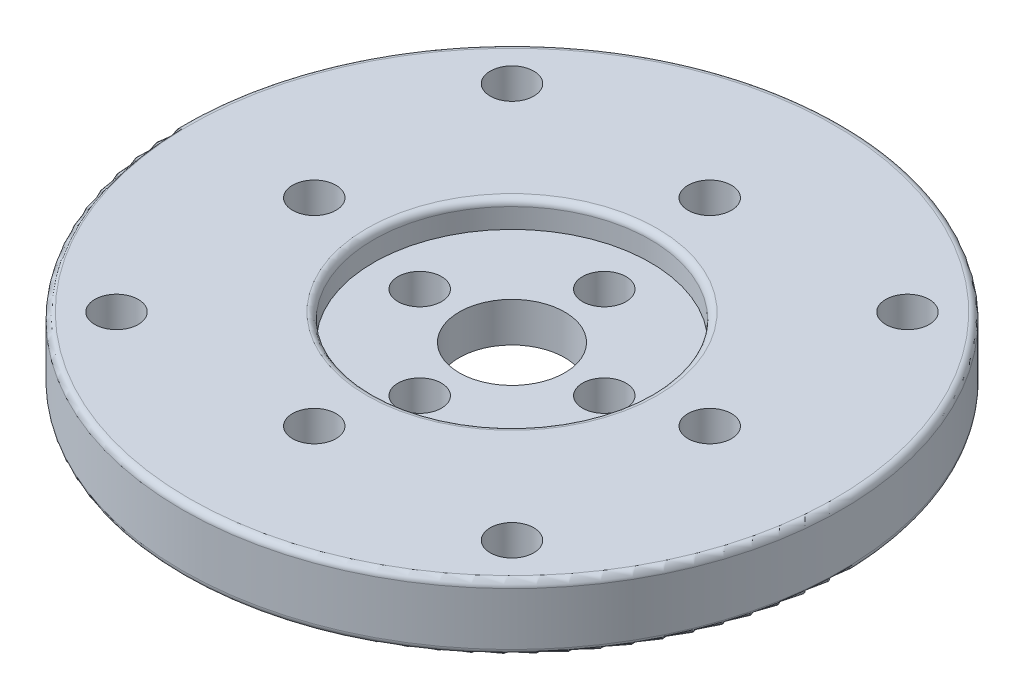
ISO-10303-21;
HEADER;
FILE_DESCRIPTION(('STEP AP214'),'2;1');
FILE_NAME('part.step','',(''),(''),'','','');
FILE_SCHEMA(('AUTOMOTIVE_DESIGN { 1 0 10303 214 1 1 1 1 }'));
ENDSEC;
DATA;
#1=APPLICATION_CONTEXT('core data for automotive mechanical design processes');
#2=APPLICATION_PROTOCOL_DEFINITION('international standard','automotive_design',2000,#1);
#3=PRODUCT_CONTEXT('',#1,'mechanical');
#4=PRODUCT('Part','Part','',(#3));
#5=PRODUCT_RELATED_PRODUCT_CATEGORY('part','',(#4));
#6=PRODUCT_DEFINITION_FORMATION('','',#4);
#7=PRODUCT_DEFINITION_CONTEXT('part definition',#1,'design');
#8=PRODUCT_DEFINITION('design','',#6,#7);
#9=PRODUCT_DEFINITION_SHAPE('','',#8);
#10=(LENGTH_UNIT() NAMED_UNIT(*) SI_UNIT(.MILLI.,.METRE.));
#11=(NAMED_UNIT(*) PLANE_ANGLE_UNIT() SI_UNIT($,.RADIAN.));
#12=(NAMED_UNIT(*) SI_UNIT($,.STERADIAN.) SOLID_ANGLE_UNIT());
#13=UNCERTAINTY_MEASURE_WITH_UNIT(LENGTH_MEASURE(1.E-05),#10,'distance_accuracy_value','');
#14=(GEOMETRIC_REPRESENTATION_CONTEXT(3) GLOBAL_UNCERTAINTY_ASSIGNED_CONTEXT((#13)) GLOBAL_UNIT_ASSIGNED_CONTEXT((#10,
#11,#12)) REPRESENTATION_CONTEXT('',''));
#15=CARTESIAN_POINT('',(0.,0.,0.));
#16=DIRECTION('',(0.,0.,1.));
#17=DIRECTION('',(1.,0.,0.));
#18=AXIS2_PLACEMENT_3D('',#15,#16,#17);
#19=CARTESIAN_POINT('',(0.,2.5,0.));
#20=DIRECTION('',(0.,-1.,0.));
#21=DIRECTION('',(0.,0.,-1.));
#22=AXIS2_PLACEMENT_3D('',#19,#20,#21);
#23=CYLINDRICAL_SURFACE('',#22,4.);
#24=CARTESIAN_POINT('',(0.,-2.5,0.));
#25=DIRECTION('',(0.,1.,0.));
#26=DIRECTION('',(0.,0.,1.));
#27=AXIS2_PLACEMENT_3D('',#24,#25,#26);
#28=CIRCLE('',#27,4.);
#29=CARTESIAN_POINT('',(0.,-2.5,4.));
#30=VERTEX_POINT('',#29);
#31=EDGE_CURVE('E59',#30,#30,#28,.T.);
#32=ORIENTED_EDGE('',*,*,#31,.F.);
#33=EDGE_LOOP('',(#32));
#34=FACE_BOUND('',#33,.T.);
#35=CARTESIAN_POINT('',(0.,0.5,0.));
#36=DIRECTION('',(0.,1.,0.));
#37=DIRECTION('',(0.,0.,1.));
#38=AXIS2_PLACEMENT_3D('',#35,#36,#37);
#39=CIRCLE('',#38,4.);
#40=CARTESIAN_POINT('',(0.,0.5,4.));
#41=VERTEX_POINT('',#40);
#42=EDGE_CURVE('E60',#41,#41,#39,.T.);
#43=ORIENTED_EDGE('',*,*,#42,.T.);
#44=EDGE_LOOP('',(#43));
#45=FACE_BOUND('',#44,.T.);
#46=ADVANCED_FACE('F33',(#34,#45),#23,.F.);
#47=CARTESIAN_POINT('',(0.,2.5,0.));
#48=DIRECTION('',(0.,1.,0.));
#49=DIRECTION('',(0.,0.,1.));
#50=AXIS2_PLACEMENT_3D('',#47,#48,#49);
#51=PLANE('',#50);
#52=CARTESIAN_POINT('',(0.,2.5,0.));
#53=DIRECTION('',(0.,1.,0.));
#54=DIRECTION('',(0.,0.,1.));
#55=AXIS2_PLACEMENT_3D('',#52,#53,#54);
#56=CIRCLE('',#55,11.);
#57=CARTESIAN_POINT('',(0.,2.5,11.));
#58=VERTEX_POINT('',#57);
#59=EDGE_CURVE('E48',#58,#58,#56,.F.);
#60=ORIENTED_EDGE('',*,*,#59,.T.);
#61=EDGE_LOOP('',(#60));
#62=FACE_BOUND('',#61,.T.);
#63=CARTESIAN_POINT('',(0.,2.5,0.));
#64=DIRECTION('',(0.,1.,0.));
#65=DIRECTION('',(0.,0.,1.));
#66=AXIS2_PLACEMENT_3D('',#63,#64,#65);
#67=CIRCLE('',#66,24.5);
#68=CARTESIAN_POINT('',(0.,2.5,24.5));
#69=VERTEX_POINT('',#68);
#70=EDGE_CURVE('E53',#69,#69,#67,.T.);
#71=ORIENTED_EDGE('',*,*,#70,.T.);
#72=EDGE_LOOP('',(#71));
#73=FACE_BOUND('',#72,.T.);
#74=CARTESIAN_POINT('',(15.,2.5,15.));
#75=DIRECTION('',(0.,1.,0.));
#76=DIRECTION('',(0.,0.,1.));
#77=AXIS2_PLACEMENT_3D('',#74,#75,#76);
#78=CIRCLE('',#77,1.65);
#79=CARTESIAN_POINT('',(15.,2.5,16.65));
#80=VERTEX_POINT('',#79);
#81=EDGE_CURVE('E94',#80,#80,#78,.F.);
#82=ORIENTED_EDGE('',*,*,#81,.T.);
#83=EDGE_LOOP('',(#82));
#84=FACE_BOUND('',#83,.T.);
#85=CARTESIAN_POINT('',(15.,2.5,-15.));
#86=DIRECTION('',(0.,1.,0.));
#87=DIRECTION('',(0.,0.,1.));
#88=AXIS2_PLACEMENT_3D('',#85,#86,#87);
#89=CIRCLE('',#88,1.65);
#90=CARTESIAN_POINT('',(15.,2.5,-13.35));
#91=VERTEX_POINT('',#90);
#92=EDGE_CURVE('E88',#91,#91,#89,.F.);
#93=ORIENTED_EDGE('',*,*,#92,.T.);
#94=EDGE_LOOP('',(#93));
#95=FACE_BOUND('',#94,.T.);
#96=CARTESIAN_POINT('',(-15.,2.5,-15.));
#97=DIRECTION('',(0.,1.,0.));
#98=DIRECTION('',(0.,0.,1.));
#99=AXIS2_PLACEMENT_3D('',#96,#97,#98);
#100=CIRCLE('',#99,1.65);
#101=CARTESIAN_POINT('',(-15.,2.5,-13.35));
#102=VERTEX_POINT('',#101);
#103=EDGE_CURVE('E82',#102,#102,#100,.F.);
#104=ORIENTED_EDGE('',*,*,#103,.T.);
#105=EDGE_LOOP('',(#104));
#106=FACE_BOUND('',#105,.T.);
#107=CARTESIAN_POINT('',(0.,2.5,15.));
#108=DIRECTION('',(0.,1.,0.));
#109=DIRECTION('',(0.,0.,1.));
#110=AXIS2_PLACEMENT_3D('',#107,#108,#109);
#111=CIRCLE('',#110,1.65);
#112=CARTESIAN_POINT('',(0.,2.5,16.65));
#113=VERTEX_POINT('',#112);
#114=EDGE_CURVE('E75',#113,#113,#111,.F.);
#115=ORIENTED_EDGE('',*,*,#114,.T.);
#116=EDGE_LOOP('',(#115));
#117=FACE_BOUND('',#116,.T.);
#118=CARTESIAN_POINT('',(15.,2.5,0.));
#119=DIRECTION('',(0.,1.,0.));
#120=DIRECTION('',(0.,0.,1.));
#121=AXIS2_PLACEMENT_3D('',#118,#119,#120);
#122=CIRCLE('',#121,1.65);
#123=CARTESIAN_POINT('',(15.,2.5,1.65));
#124=VERTEX_POINT('',#123);
#125=EDGE_CURVE('E112',#124,#124,#122,.F.);
#126=ORIENTED_EDGE('',*,*,#125,.T.);
#127=EDGE_LOOP('',(#126));
#128=FACE_BOUND('',#127,.T.);
#129=CARTESIAN_POINT('',(0.,2.5,-15.));
#130=DIRECTION('',(0.,1.,0.));
#131=DIRECTION('',(0.,0.,1.));
#132=AXIS2_PLACEMENT_3D('',#129,#130,#131);
#133=CIRCLE('',#132,1.65);
#134=CARTESIAN_POINT('',(0.,2.5,-13.35));
#135=VERTEX_POINT('',#134);
#136=EDGE_CURVE('E106',#135,#135,#133,.F.);
#137=ORIENTED_EDGE('',*,*,#136,.T.);
#138=EDGE_LOOP('',(#137));
#139=FACE_BOUND('',#138,.T.);
#140=CARTESIAN_POINT('',(-15.,2.5,0.));
#141=DIRECTION('',(0.,1.,0.));
#142=DIRECTION('',(0.,0.,1.));
#143=AXIS2_PLACEMENT_3D('',#140,#141,#142);
#144=CIRCLE('',#143,1.65);
#145=CARTESIAN_POINT('',(-15.,2.5,1.65));
#146=VERTEX_POINT('',#145);
#147=EDGE_CURVE('E99',#146,#146,#144,.F.);
#148=ORIENTED_EDGE('',*,*,#147,.T.);
#149=EDGE_LOOP('',(#148));
#150=FACE_BOUND('',#149,.T.);
#151=CARTESIAN_POINT('',(-15.,2.5,15.));
#152=DIRECTION('',(0.,1.,0.));
#153=DIRECTION('',(0.,0.,1.));
#154=AXIS2_PLACEMENT_3D('',#151,#152,#153);
#155=CIRCLE('',#154,1.65);
#156=CARTESIAN_POINT('',(-15.,2.5,16.65));
#157=VERTEX_POINT('',#156);
#158=EDGE_CURVE('E69',#157,#157,#155,.F.);
#159=ORIENTED_EDGE('',*,*,#158,.T.);
#160=EDGE_LOOP('',(#159));
#161=FACE_BOUND('',#160,.T.);
#162=ADVANCED_FACE('F171',(#62,#73,#84,#95,#106,#117,#128,#139,#150,#161),#51,.T.);
#163=CARTESIAN_POINT('',(0.,-2.5,0.));
#164=DIRECTION('',(0.,1.,0.));
#165=DIRECTION('',(0.,0.,1.));
#166=AXIS2_PLACEMENT_3D('',#163,#164,#165);
#167=PLANE('',#166);
#168=CARTESIAN_POINT('',(0.,-2.5,-7.));
#169=DIRECTION('',(0.,1.,0.));
#170=DIRECTION('',(0.,0.,1.));
#171=AXIS2_PLACEMENT_3D('',#168,#169,#170);
#172=CIRCLE('',#171,1.65);
#173=CARTESIAN_POINT('',(0.,-2.5,-5.35));
#174=VERTEX_POINT('',#173);
#175=EDGE_CURVE('E103',#174,#174,#172,.F.);
#176=ORIENTED_EDGE('',*,*,#175,.F.);
#177=EDGE_LOOP('',(#176));
#178=FACE_BOUND('',#177,.T.);
#179=CARTESIAN_POINT('',(0.,-2.5,7.));
#180=DIRECTION('',(0.,1.,0.));
#181=DIRECTION('',(0.,0.,1.));
#182=AXIS2_PLACEMENT_3D('',#179,#180,#181);
#183=CIRCLE('',#182,1.65);
#184=CARTESIAN_POINT('',(0.,-2.5,8.65));
#185=VERTEX_POINT('',#184);
#186=EDGE_CURVE('E130',#185,#185,#183,.F.);
#187=ORIENTED_EDGE('',*,*,#186,.F.);
#188=EDGE_LOOP('',(#187));
#189=FACE_BOUND('',#188,.T.);
#190=CARTESIAN_POINT('',(7.,-2.5,0.));
#191=DIRECTION('',(0.,1.,0.));
#192=DIRECTION('',(0.,0.,1.));
#193=AXIS2_PLACEMENT_3D('',#190,#191,#192);
#194=CIRCLE('',#193,1.65);
#195=CARTESIAN_POINT('',(7.,-2.5,1.65));
#196=VERTEX_POINT('',#195);
#197=EDGE_CURVE('E124',#196,#196,#194,.F.);
#198=ORIENTED_EDGE('',*,*,#197,.F.);
#199=EDGE_LOOP('',(#198));
#200=FACE_BOUND('',#199,.T.);
#201=CARTESIAN_POINT('',(-7.,-2.5,0.));
#202=DIRECTION('',(0.,1.,0.));
#203=DIRECTION('',(0.,0.,1.));
#204=AXIS2_PLACEMENT_3D('',#201,#202,#203);
#205=CIRCLE('',#204,1.65);
#206=CARTESIAN_POINT('',(-7.,-2.5,1.65));
#207=VERTEX_POINT('',#206);
#208=EDGE_CURVE('E117',#207,#207,#205,.F.);
#209=ORIENTED_EDGE('',*,*,#208,.F.);
#210=EDGE_LOOP('',(#209));
#211=FACE_BOUND('',#210,.T.);
#212=CARTESIAN_POINT('',(0.,-2.5,0.));
#213=DIRECTION('',(0.,1.,0.));
#214=DIRECTION('',(0.,0.,1.));
#215=AXIS2_PLACEMENT_3D('',#212,#213,#214);
#216=CIRCLE('',#215,24.5);
#217=CARTESIAN_POINT('',(0.,-2.5,24.5));
#218=VERTEX_POINT('',#217);
#219=EDGE_CURVE('E10',#218,#218,#216,.F.);
#220=ORIENTED_EDGE('',*,*,#219,.T.);
#221=EDGE_LOOP('',(#220));
#222=FACE_BOUND('',#221,.T.);
#223=CARTESIAN_POINT('',(15.,-2.5,15.));
#224=DIRECTION('',(0.,-1.,0.));
#225=DIRECTION('',(0.,0.,-1.));
#226=AXIS2_PLACEMENT_3D('',#223,#224,#225);
#227=CIRCLE('',#226,1.65);
#228=CARTESIAN_POINT('',(15.,-2.5,13.35));
#229=VERTEX_POINT('',#228);
#230=EDGE_CURVE('E72',#229,#229,#227,.T.);
#231=ORIENTED_EDGE('',*,*,#230,.F.);
#232=EDGE_LOOP('',(#231));
#233=FACE_BOUND('',#232,.T.);
#234=CARTESIAN_POINT('',(15.,-2.5,-15.));
#235=DIRECTION('',(0.,-1.,0.));
#236=DIRECTION('',(0.,0.,-1.));
#237=AXIS2_PLACEMENT_3D('',#234,#235,#236);
#238=CIRCLE('',#237,1.65);
#239=CARTESIAN_POINT('',(15.,-2.5,-16.65));
#240=VERTEX_POINT('',#239);
#241=EDGE_CURVE('E91',#240,#240,#238,.T.);
#242=ORIENTED_EDGE('',*,*,#241,.F.);
#243=EDGE_LOOP('',(#242));
#244=FACE_BOUND('',#243,.T.);
#245=CARTESIAN_POINT('',(-15.,-2.5,-15.));
#246=DIRECTION('',(0.,-1.,0.));
#247=DIRECTION('',(0.,0.,-1.));
#248=AXIS2_PLACEMENT_3D('',#245,#246,#247);
#249=CIRCLE('',#248,1.65);
#250=CARTESIAN_POINT('',(-15.,-2.5,-16.65));
#251=VERTEX_POINT('',#250);
#252=EDGE_CURVE('E85',#251,#251,#249,.T.);
#253=ORIENTED_EDGE('',*,*,#252,.F.);
#254=EDGE_LOOP('',(#253));
#255=FACE_BOUND('',#254,.T.);
#256=CARTESIAN_POINT('',(0.,-2.5,15.));
#257=DIRECTION('',(0.,-1.,0.));
#258=DIRECTION('',(0.,0.,-1.));
#259=AXIS2_PLACEMENT_3D('',#256,#257,#258);
#260=CIRCLE('',#259,1.65);
#261=CARTESIAN_POINT('',(0.,-2.5,13.35));
#262=VERTEX_POINT('',#261);
#263=EDGE_CURVE('E78',#262,#262,#260,.T.);
#264=ORIENTED_EDGE('',*,*,#263,.F.);
#265=EDGE_LOOP('',(#264));
#266=FACE_BOUND('',#265,.T.);
#267=CARTESIAN_POINT('',(15.,-2.5,0.));
#268=DIRECTION('',(0.,-1.,0.));
#269=DIRECTION('',(0.,0.,-1.));
#270=AXIS2_PLACEMENT_3D('',#267,#268,#269);
#271=CIRCLE('',#270,1.65);
#272=CARTESIAN_POINT('',(15.,-2.5,-1.65));
#273=VERTEX_POINT('',#272);
#274=EDGE_CURVE('E79',#273,#273,#271,.T.);
#275=ORIENTED_EDGE('',*,*,#274,.F.);
#276=EDGE_LOOP('',(#275));
#277=FACE_BOUND('',#276,.T.);
#278=CARTESIAN_POINT('',(0.,-2.5,-15.));
#279=DIRECTION('',(0.,-1.,0.));
#280=DIRECTION('',(0.,0.,-1.));
#281=AXIS2_PLACEMENT_3D('',#278,#279,#280);
#282=CIRCLE('',#281,1.65);
#283=CARTESIAN_POINT('',(0.,-2.5,-16.65));
#284=VERTEX_POINT('',#283);
#285=EDGE_CURVE('E109',#284,#284,#282,.T.);
#286=ORIENTED_EDGE('',*,*,#285,.F.);
#287=EDGE_LOOP('',(#286));
#288=FACE_BOUND('',#287,.T.);
#289=CARTESIAN_POINT('',(-15.,-2.5,0.));
#290=DIRECTION('',(0.,-1.,0.));
#291=DIRECTION('',(0.,0.,-1.));
#292=AXIS2_PLACEMENT_3D('',#289,#290,#291);
#293=CIRCLE('',#292,1.65);
#294=CARTESIAN_POINT('',(-15.,-2.5,-1.65));
#295=VERTEX_POINT('',#294);
#296=EDGE_CURVE('E102',#295,#295,#293,.T.);
#297=ORIENTED_EDGE('',*,*,#296,.F.);
#298=EDGE_LOOP('',(#297));
#299=FACE_BOUND('',#298,.T.);
#300=CARTESIAN_POINT('',(-15.,-2.5,15.));
#301=DIRECTION('',(0.,-1.,0.));
#302=DIRECTION('',(0.,0.,-1.));
#303=AXIS2_PLACEMENT_3D('',#300,#301,#302);
#304=CIRCLE('',#303,1.65);
#305=CARTESIAN_POINT('',(-15.,-2.5,13.35));
#306=VERTEX_POINT('',#305);
#307=EDGE_CURVE('E68',#306,#306,#304,.T.);
#308=ORIENTED_EDGE('',*,*,#307,.F.);
#309=EDGE_LOOP('',(#308));
#310=FACE_BOUND('',#309,.T.);
#311=ORIENTED_EDGE('',*,*,#31,.T.);
#312=EDGE_LOOP('',(#311));
#313=FACE_BOUND('',#312,.T.);
#314=ADVANCED_FACE('F167',(#178,#189,#200,#211,#222,#233,#244,#255,#266,#277,#288,#299,#310,
#313),#167,.F.);
#315=CARTESIAN_POINT('',(0.,2.5,0.));
#316=DIRECTION('',(0.,-1.,0.));
#317=DIRECTION('',(0.,0.,-1.));
#318=AXIS2_PLACEMENT_3D('',#315,#316,#317);
#319=CYLINDRICAL_SURFACE('',#318,25.);
#320=CARTESIAN_POINT('',(0.,-2.,0.));
#321=DIRECTION('',(0.,1.,0.));
#322=DIRECTION('',(0.,0.,1.));
#323=AXIS2_PLACEMENT_3D('',#320,#321,#322);
#324=CIRCLE('',#323,25.);
#325=CARTESIAN_POINT('',(0.,-2.,25.));
#326=VERTEX_POINT('',#325);
#327=EDGE_CURVE('E40',#326,#326,#324,.T.);
#328=ORIENTED_EDGE('',*,*,#327,.T.);
#329=EDGE_LOOP('',(#328));
#330=FACE_BOUND('',#329,.T.);
#331=CARTESIAN_POINT('',(0.,2.,0.));
#332=DIRECTION('',(0.,1.,0.));
#333=DIRECTION('',(0.,0.,1.));
#334=AXIS2_PLACEMENT_3D('',#331,#332,#333);
#335=CIRCLE('',#334,25.);
#336=CARTESIAN_POINT('',(0.,2.,25.));
#337=VERTEX_POINT('',#336);
#338=EDGE_CURVE('E44',#337,#337,#335,.F.);
#339=ORIENTED_EDGE('',*,*,#338,.T.);
#340=EDGE_LOOP('',(#339));
#341=FACE_BOUND('',#340,.T.);
#342=ADVANCED_FACE('F161',(#330,#341),#319,.T.);
#343=CARTESIAN_POINT('',(0.,0.5,0.));
#344=DIRECTION('',(0.,1.,0.));
#345=DIRECTION('',(0.,0.,1.));
#346=AXIS2_PLACEMENT_3D('',#343,#344,#345);
#347=CYLINDRICAL_SURFACE('',#346,10.5);
#348=CARTESIAN_POINT('',(0.,2.,0.));
#349=DIRECTION('',(0.,1.,0.));
#350=DIRECTION('',(0.,0.,1.));
#351=AXIS2_PLACEMENT_3D('',#348,#349,#350);
#352=CIRCLE('',#351,10.5);
#353=CARTESIAN_POINT('',(0.,2.,10.5));
#354=VERTEX_POINT('',#353);
#355=EDGE_CURVE('E56',#354,#354,#352,.T.);
#356=ORIENTED_EDGE('',*,*,#355,.T.);
#357=EDGE_LOOP('',(#356));
#358=FACE_BOUND('',#357,.T.);
#359=CARTESIAN_POINT('',(0.,0.5,0.));
#360=DIRECTION('',(0.,1.,0.));
#361=DIRECTION('',(0.,0.,1.));
#362=AXIS2_PLACEMENT_3D('',#359,#360,#361);
#363=CIRCLE('',#362,10.5);
#364=CARTESIAN_POINT('',(0.,0.5,10.5));
#365=VERTEX_POINT('',#364);
#366=EDGE_CURVE('E63',#365,#365,#363,.T.);
#367=ORIENTED_EDGE('',*,*,#366,.F.);
#368=EDGE_LOOP('',(#367));
#369=FACE_BOUND('',#368,.T.);
#370=ADVANCED_FACE('F148',(#358,#369),#347,.F.);
#371=CARTESIAN_POINT('',(0.,0.5,0.));
#372=DIRECTION('',(0.,1.,0.));
#373=DIRECTION('',(0.,0.,1.));
#374=AXIS2_PLACEMENT_3D('',#371,#372,#373);
#375=PLANE('',#374);
#376=CARTESIAN_POINT('',(0.,0.5,-7.));
#377=DIRECTION('',(0.,1.,0.));
#378=DIRECTION('',(0.,0.,1.));
#379=AXIS2_PLACEMENT_3D('',#376,#377,#378);
#380=CIRCLE('',#379,1.65);
#381=CARTESIAN_POINT('',(0.,0.5,-5.35));
#382=VERTEX_POINT('',#381);
#383=EDGE_CURVE('E133',#382,#382,#380,.T.);
#384=ORIENTED_EDGE('',*,*,#383,.F.);
#385=EDGE_LOOP('',(#384));
#386=FACE_BOUND('',#385,.T.);
#387=CARTESIAN_POINT('',(0.,0.5,7.));
#388=DIRECTION('',(0.,1.,0.));
#389=DIRECTION('',(0.,0.,1.));
#390=AXIS2_PLACEMENT_3D('',#387,#388,#389);
#391=CIRCLE('',#390,1.65);
#392=CARTESIAN_POINT('',(0.,0.5,8.65));
#393=VERTEX_POINT('',#392);
#394=EDGE_CURVE('E127',#393,#393,#391,.T.);
#395=ORIENTED_EDGE('',*,*,#394,.F.);
#396=EDGE_LOOP('',(#395));
#397=FACE_BOUND('',#396,.T.);
#398=CARTESIAN_POINT('',(7.,0.5,0.));
#399=DIRECTION('',(0.,1.,0.));
#400=DIRECTION('',(0.,0.,1.));
#401=AXIS2_PLACEMENT_3D('',#398,#399,#400);
#402=CIRCLE('',#401,1.65);
#403=CARTESIAN_POINT('',(7.,0.5,1.65));
#404=VERTEX_POINT('',#403);
#405=EDGE_CURVE('E120',#404,#404,#402,.T.);
#406=ORIENTED_EDGE('',*,*,#405,.F.);
#407=EDGE_LOOP('',(#406));
#408=FACE_BOUND('',#407,.T.);
#409=CARTESIAN_POINT('',(-7.,0.5,0.));
#410=DIRECTION('',(0.,1.,0.));
#411=DIRECTION('',(0.,0.,1.));
#412=AXIS2_PLACEMENT_3D('',#409,#410,#411);
#413=CIRCLE('',#412,1.65);
#414=CARTESIAN_POINT('',(-7.,0.5,1.65));
#415=VERTEX_POINT('',#414);
#416=EDGE_CURVE('E121',#415,#415,#413,.T.);
#417=ORIENTED_EDGE('',*,*,#416,.F.);
#418=EDGE_LOOP('',(#417));
#419=FACE_BOUND('',#418,.T.);
#420=ORIENTED_EDGE('',*,*,#42,.F.);
#421=EDGE_LOOP('',(#420));
#422=FACE_BOUND('',#421,.T.);
#423=ORIENTED_EDGE('',*,*,#366,.T.);
#424=EDGE_LOOP('',(#423));
#425=FACE_BOUND('',#424,.T.);
#426=ADVANCED_FACE('F144',(#386,#397,#408,#419,#422,#425),#375,.T.);
#427=CARTESIAN_POINT('',(-15.,2.501,15.));
#428=DIRECTION('',(0.,-1.,0.));
#429=DIRECTION('',(0.,0.,-1.));
#430=AXIS2_PLACEMENT_3D('',#427,#428,#429);
#431=CYLINDRICAL_SURFACE('',#430,1.65);
#432=ORIENTED_EDGE('',*,*,#158,.F.);
#433=EDGE_LOOP('',(#432));
#434=FACE_BOUND('',#433,.T.);
#435=ORIENTED_EDGE('',*,*,#307,.T.);
#436=EDGE_LOOP('',(#435));
#437=FACE_BOUND('',#436,.T.);
#438=ADVANCED_FACE('F147',(#434,#437),#431,.F.);
#439=CARTESIAN_POINT('',(-15.,2.501,0.));
#440=DIRECTION('',(0.,-1.,0.));
#441=DIRECTION('',(0.,0.,-1.));
#442=AXIS2_PLACEMENT_3D('',#439,#440,#441);
#443=CYLINDRICAL_SURFACE('',#442,1.65);
#444=ORIENTED_EDGE('',*,*,#147,.F.);
#445=EDGE_LOOP('',(#444));
#446=FACE_BOUND('',#445,.T.);
#447=ORIENTED_EDGE('',*,*,#296,.T.);
#448=EDGE_LOOP('',(#447));
#449=FACE_BOUND('',#448,.T.);
#450=ADVANCED_FACE('F226',(#446,#449),#443,.F.);
#451=CARTESIAN_POINT('',(0.,2.501,-15.));
#452=DIRECTION('',(0.,-1.,0.));
#453=DIRECTION('',(0.,0.,-1.));
#454=AXIS2_PLACEMENT_3D('',#451,#452,#453);
#455=CYLINDRICAL_SURFACE('',#454,1.65);
#456=ORIENTED_EDGE('',*,*,#136,.F.);
#457=EDGE_LOOP('',(#456));
#458=FACE_BOUND('',#457,.T.);
#459=ORIENTED_EDGE('',*,*,#285,.T.);
#460=EDGE_LOOP('',(#459));
#461=FACE_BOUND('',#460,.T.);
#462=ADVANCED_FACE('F234',(#458,#461),#455,.F.);
#463=CARTESIAN_POINT('',(15.,2.501,0.));
#464=DIRECTION('',(0.,-1.,0.));
#465=DIRECTION('',(0.,0.,-1.));
#466=AXIS2_PLACEMENT_3D('',#463,#464,#465);
#467=CYLINDRICAL_SURFACE('',#466,1.65);
#468=ORIENTED_EDGE('',*,*,#125,.F.);
#469=EDGE_LOOP('',(#468));
#470=FACE_BOUND('',#469,.T.);
#471=ORIENTED_EDGE('',*,*,#274,.T.);
#472=EDGE_LOOP('',(#471));
#473=FACE_BOUND('',#472,.T.);
#474=ADVANCED_FACE('F242',(#470,#473),#467,.F.);
#475=CARTESIAN_POINT('',(0.,2.501,15.));
#476=DIRECTION('',(0.,-1.,0.));
#477=DIRECTION('',(0.,0.,-1.));
#478=AXIS2_PLACEMENT_3D('',#475,#476,#477);
#479=CYLINDRICAL_SURFACE('',#478,1.65);
#480=ORIENTED_EDGE('',*,*,#114,.F.);
#481=EDGE_LOOP('',(#480));
#482=FACE_BOUND('',#481,.T.);
#483=ORIENTED_EDGE('',*,*,#263,.T.);
#484=EDGE_LOOP('',(#483));
#485=FACE_BOUND('',#484,.T.);
#486=ADVANCED_FACE('F238',(#482,#485),#479,.F.);
#487=CARTESIAN_POINT('',(-15.,2.501,-15.));
#488=DIRECTION('',(0.,-1.,0.));
#489=DIRECTION('',(0.,0.,-1.));
#490=AXIS2_PLACEMENT_3D('',#487,#488,#489);
#491=CYLINDRICAL_SURFACE('',#490,1.65);
#492=ORIENTED_EDGE('',*,*,#103,.F.);
#493=EDGE_LOOP('',(#492));
#494=FACE_BOUND('',#493,.T.);
#495=ORIENTED_EDGE('',*,*,#252,.T.);
#496=EDGE_LOOP('',(#495));
#497=FACE_BOUND('',#496,.T.);
#498=ADVANCED_FACE('F241',(#494,#497),#491,.F.);
#499=CARTESIAN_POINT('',(15.,2.501,-15.));
#500=DIRECTION('',(0.,-1.,0.));
#501=DIRECTION('',(0.,0.,-1.));
#502=AXIS2_PLACEMENT_3D('',#499,#500,#501);
#503=CYLINDRICAL_SURFACE('',#502,1.65);
#504=ORIENTED_EDGE('',*,*,#92,.F.);
#505=EDGE_LOOP('',(#504));
#506=FACE_BOUND('',#505,.T.);
#507=ORIENTED_EDGE('',*,*,#241,.T.);
#508=EDGE_LOOP('',(#507));
#509=FACE_BOUND('',#508,.T.);
#510=ADVANCED_FACE('F246',(#506,#509),#503,.F.);
#511=CARTESIAN_POINT('',(15.,2.501,15.));
#512=DIRECTION('',(0.,-1.,0.));
#513=DIRECTION('',(0.,0.,-1.));
#514=AXIS2_PLACEMENT_3D('',#511,#512,#513);
#515=CYLINDRICAL_SURFACE('',#514,1.65);
#516=ORIENTED_EDGE('',*,*,#81,.F.);
#517=EDGE_LOOP('',(#516));
#518=FACE_BOUND('',#517,.T.);
#519=ORIENTED_EDGE('',*,*,#230,.T.);
#520=EDGE_LOOP('',(#519));
#521=FACE_BOUND('',#520,.T.);
#522=ADVANCED_FACE('F187',(#518,#521),#515,.F.);
#523=CARTESIAN_POINT('',(0.,2.,0.));
#524=DIRECTION('',(0.,1.,0.));
#525=DIRECTION('',(0.,0.,1.));
#526=AXIS2_PLACEMENT_3D('',#523,#524,#525);
#527=TOROIDAL_SURFACE('',#526,11.,0.5);
#528=ORIENTED_EDGE('',*,*,#59,.F.);
#529=EDGE_LOOP('',(#528));
#530=FACE_BOUND('',#529,.T.);
#531=ORIENTED_EDGE('',*,*,#355,.F.);
#532=EDGE_LOOP('',(#531));
#533=FACE_BOUND('',#532,.T.);
#534=ADVANCED_FACE('F184',(#530,#533),#527,.T.);
#535=CARTESIAN_POINT('',(0.,-2.,0.));
#536=DIRECTION('',(0.,1.,0.));
#537=DIRECTION('',(0.,0.,1.));
#538=AXIS2_PLACEMENT_3D('',#535,#536,#537);
#539=TOROIDAL_SURFACE('',#538,24.5,0.5);
#540=ORIENTED_EDGE('',*,*,#219,.F.);
#541=EDGE_LOOP('',(#540));
#542=FACE_BOUND('',#541,.T.);
#543=ORIENTED_EDGE('',*,*,#327,.F.);
#544=EDGE_LOOP('',(#543));
#545=FACE_BOUND('',#544,.T.);
#546=ADVANCED_FACE('F186',(#542,#545),#539,.T.);
#547=CARTESIAN_POINT('',(0.,2.,0.));
#548=DIRECTION('',(0.,1.,0.));
#549=DIRECTION('',(0.,0.,1.));
#550=AXIS2_PLACEMENT_3D('',#547,#548,#549);
#551=TOROIDAL_SURFACE('',#550,24.5,0.5);
#552=ORIENTED_EDGE('',*,*,#338,.F.);
#553=EDGE_LOOP('',(#552));
#554=FACE_BOUND('',#553,.T.);
#555=ORIENTED_EDGE('',*,*,#70,.F.);
#556=EDGE_LOOP('',(#555));
#557=FACE_BOUND('',#556,.T.);
#558=ADVANCED_FACE('F35',(#554,#557),#551,.T.);
#559=CARTESIAN_POINT('',(-7.,-2.501,0.));
#560=DIRECTION('',(0.,1.,0.));
#561=DIRECTION('',(0.,0.,1.));
#562=AXIS2_PLACEMENT_3D('',#559,#560,#561);
#563=CYLINDRICAL_SURFACE('',#562,1.65);
#564=CARTESIAN_POINT('',(-7.,0.5,1.65));
#565=CARTESIAN_POINT('',(-7.,0.46875,1.65));
#566=CARTESIAN_POINT('',(-7.,0.4375,1.65));
#567=CARTESIAN_POINT('',(-7.,0.374999999999999,1.65));
#568=CARTESIAN_POINT('',(-7.,0.343749999999999,1.65));
#569=CARTESIAN_POINT('',(-7.,0.281249999999999,1.65));
#570=CARTESIAN_POINT('',(-7.,0.249999999999999,1.65));
#571=CARTESIAN_POINT('',(-7.,0.187499999999999,1.65));
#572=CARTESIAN_POINT('',(-7.,0.15625,1.65));
#573=CARTESIAN_POINT('',(-7.,0.0937499999999997,1.65));
#574=CARTESIAN_POINT('',(-7.,0.0624999999999996,1.65));
#575=CARTESIAN_POINT('',(-7.,0.,1.65));
#576=CARTESIAN_POINT('',(-7.,-0.0312500000000005,1.65));
#577=CARTESIAN_POINT('',(-7.,-0.0937500000000005,1.65));
#578=CARTESIAN_POINT('',(-7.,-0.125000000000001,1.65));
#579=CARTESIAN_POINT('',(-7.,-0.1875,1.65));
#580=CARTESIAN_POINT('',(-7.,-0.21875,1.65));
#581=CARTESIAN_POINT('',(-7.,-0.28125,1.65));
#582=CARTESIAN_POINT('',(-7.,-0.3125,1.65));
#583=CARTESIAN_POINT('',(-7.,-0.375,1.65));
#584=CARTESIAN_POINT('',(-7.,-0.40625,1.65));
#585=CARTESIAN_POINT('',(-7.,-0.46875,1.65));
#586=CARTESIAN_POINT('',(-7.,-0.5,1.65));
#587=CARTESIAN_POINT('',(-7.,-0.5625,1.65));
#588=CARTESIAN_POINT('',(-7.,-0.59375,1.65));
#589=CARTESIAN_POINT('',(-7.,-0.65625,1.65));
#590=CARTESIAN_POINT('',(-7.,-0.6875,1.65));
#591=CARTESIAN_POINT('',(-7.,-0.75,1.65));
#592=CARTESIAN_POINT('',(-7.,-0.78125,1.65));
#593=CARTESIAN_POINT('',(-7.,-0.84375,1.65));
#594=CARTESIAN_POINT('',(-7.,-0.875,1.65));
#595=CARTESIAN_POINT('',(-7.,-0.9375,1.65));
#596=CARTESIAN_POINT('',(-7.,-0.96875,1.65));
#597=CARTESIAN_POINT('',(-7.,-1.03125,1.65));
#598=CARTESIAN_POINT('',(-7.,-1.0625,1.65));
#599=CARTESIAN_POINT('',(-7.,-1.125,1.65));
#600=CARTESIAN_POINT('',(-7.,-1.15625,1.65));
#601=CARTESIAN_POINT('',(-7.,-1.21875,1.65));
#602=CARTESIAN_POINT('',(-7.,-1.25,1.65));
#603=CARTESIAN_POINT('',(-7.,-1.3125,1.65));
#604=CARTESIAN_POINT('',(-7.,-1.34375,1.65));
#605=CARTESIAN_POINT('',(-7.,-1.40625,1.65));
#606=CARTESIAN_POINT('',(-7.,-1.4375,1.65));
#607=CARTESIAN_POINT('',(-7.,-1.5,1.65));
#608=CARTESIAN_POINT('',(-7.,-1.53125,1.65));
#609=CARTESIAN_POINT('',(-7.,-1.59375,1.65));
#610=CARTESIAN_POINT('',(-7.,-1.625,1.65));
#611=CARTESIAN_POINT('',(-7.,-1.6875,1.65));
#612=CARTESIAN_POINT('',(-7.,-1.71875,1.65));
#613=CARTESIAN_POINT('',(-7.,-1.78125,1.65));
#614=CARTESIAN_POINT('',(-7.,-1.8125,1.65));
#615=CARTESIAN_POINT('',(-7.,-1.875,1.65));
#616=CARTESIAN_POINT('',(-7.,-1.90625,1.65));
#617=CARTESIAN_POINT('',(-7.,-1.96875,1.65));
#618=CARTESIAN_POINT('',(-7.,-2.,1.65));
#619=CARTESIAN_POINT('',(-7.,-2.0625,1.65));
#620=CARTESIAN_POINT('',(-7.,-2.09375,1.65));
#621=CARTESIAN_POINT('',(-7.,-2.15625,1.65));
#622=CARTESIAN_POINT('',(-7.,-2.1875,1.65));
#623=CARTESIAN_POINT('',(-7.,-2.25,1.65));
#624=CARTESIAN_POINT('',(-7.,-2.28125,1.65));
#625=CARTESIAN_POINT('',(-7.,-2.34375,1.65));
#626=CARTESIAN_POINT('',(-7.,-2.375,1.65));
#627=CARTESIAN_POINT('',(-7.,-2.4375,1.65));
#628=CARTESIAN_POINT('',(-7.,-2.46875,1.65));
#629=CARTESIAN_POINT('',(-7.,-2.5,1.65));
#630=B_SPLINE_CURVE_WITH_KNOTS('',3,(#564,#565,#566,#567,#568,#569,#570,#571,#572,#573,#574,
#575,#576,#577,#578,#579,#580,#581,#582,#583,#584,#585,#586,#587,#588,#589,#590,#591,#592,#593,
#594,#595,#596,#597,#598,#599,#600,#601,#602,#603,#604,#605,#606,#607,#608,#609,#610,#611,#612,
#613,#614,#615,#616,#617,#618,#619,#620,#621,#622,#623,#624,#625,#626,#627,#628,#629),
.UNSPECIFIED.,.F.,.F.,(4,2,2,2,2,2,2,2,2,2,2,2,2,2,2,2,2,2,2,2,2,2,2,2,2,2,2,2,2,2,2,2,4),(0.,
0.0937500000000001,0.1875,0.28125,0.375,0.46875,0.5625,0.65625,0.75,0.84375,0.9375,1.03125,
1.125,1.21875,1.3125,1.40625,1.5,1.59375,1.6875,1.78125,1.875,1.96875,2.0625,2.15625,2.25,
2.34375,2.4375,2.53125,2.625,2.71875,2.8125,2.90625,3.),.UNSPECIFIED.);
#631=EDGE_CURVE('BSEAM194',#415,#207,#630,.T.);
#632=ORIENTED_EDGE('',*,*,#416,.T.);
#633=ORIENTED_EDGE('',*,*,#208,.T.);
#634=ORIENTED_EDGE('',*,*,#631,.T.);
#635=ORIENTED_EDGE('',*,*,#631,.F.);
#636=EDGE_LOOP('',(#632,#634,#633,#635));
#637=FACE_BOUND('',#636,.T.);
#638=ADVANCED_FACE('F194',(#637),#563,.F.);
#639=CARTESIAN_POINT('',(7.,-2.501,0.));
#640=DIRECTION('',(0.,1.,0.));
#641=DIRECTION('',(0.,0.,1.));
#642=AXIS2_PLACEMENT_3D('',#639,#640,#641);
#643=CYLINDRICAL_SURFACE('',#642,1.65);
#644=CARTESIAN_POINT('',(7.,0.5,1.65));
#645=CARTESIAN_POINT('',(7.,0.46875,1.65));
#646=CARTESIAN_POINT('',(7.,0.4375,1.65));
#647=CARTESIAN_POINT('',(7.,0.374999999999999,1.65));
#648=CARTESIAN_POINT('',(7.,0.343749999999999,1.65));
#649=CARTESIAN_POINT('',(7.,0.281249999999999,1.65));
#650=CARTESIAN_POINT('',(7.,0.249999999999999,1.65));
#651=CARTESIAN_POINT('',(7.,0.187499999999999,1.65));
#652=CARTESIAN_POINT('',(7.,0.15625,1.65));
#653=CARTESIAN_POINT('',(7.,0.0937499999999997,1.65));
#654=CARTESIAN_POINT('',(7.,0.0624999999999996,1.65));
#655=CARTESIAN_POINT('',(7.,0.,1.65));
#656=CARTESIAN_POINT('',(7.,-0.0312500000000005,1.65));
#657=CARTESIAN_POINT('',(7.,-0.0937500000000005,1.65));
#658=CARTESIAN_POINT('',(7.,-0.125000000000001,1.65));
#659=CARTESIAN_POINT('',(7.,-0.1875,1.65));
#660=CARTESIAN_POINT('',(7.,-0.21875,1.65));
#661=CARTESIAN_POINT('',(7.,-0.28125,1.65));
#662=CARTESIAN_POINT('',(7.,-0.3125,1.65));
#663=CARTESIAN_POINT('',(7.,-0.375,1.65));
#664=CARTESIAN_POINT('',(7.,-0.40625,1.65));
#665=CARTESIAN_POINT('',(7.,-0.46875,1.65));
#666=CARTESIAN_POINT('',(7.,-0.5,1.65));
#667=CARTESIAN_POINT('',(7.,-0.5625,1.65));
#668=CARTESIAN_POINT('',(7.,-0.59375,1.65));
#669=CARTESIAN_POINT('',(7.,-0.65625,1.65));
#670=CARTESIAN_POINT('',(7.,-0.6875,1.65));
#671=CARTESIAN_POINT('',(7.,-0.75,1.65));
#672=CARTESIAN_POINT('',(7.,-0.78125,1.65));
#673=CARTESIAN_POINT('',(7.,-0.84375,1.65));
#674=CARTESIAN_POINT('',(7.,-0.875,1.65));
#675=CARTESIAN_POINT('',(7.,-0.9375,1.65));
#676=CARTESIAN_POINT('',(7.,-0.96875,1.65));
#677=CARTESIAN_POINT('',(7.,-1.03125,1.65));
#678=CARTESIAN_POINT('',(7.,-1.0625,1.65));
#679=CARTESIAN_POINT('',(7.,-1.125,1.65));
#680=CARTESIAN_POINT('',(7.,-1.15625,1.65));
#681=CARTESIAN_POINT('',(7.,-1.21875,1.65));
#682=CARTESIAN_POINT('',(7.,-1.25,1.65));
#683=CARTESIAN_POINT('',(7.,-1.3125,1.65));
#684=CARTESIAN_POINT('',(7.,-1.34375,1.65));
#685=CARTESIAN_POINT('',(7.,-1.40625,1.65));
#686=CARTESIAN_POINT('',(7.,-1.4375,1.65));
#687=CARTESIAN_POINT('',(7.,-1.5,1.65));
#688=CARTESIAN_POINT('',(7.,-1.53125,1.65));
#689=CARTESIAN_POINT('',(7.,-1.59375,1.65));
#690=CARTESIAN_POINT('',(7.,-1.625,1.65));
#691=CARTESIAN_POINT('',(7.,-1.6875,1.65));
#692=CARTESIAN_POINT('',(7.,-1.71875,1.65));
#693=CARTESIAN_POINT('',(7.,-1.78125,1.65));
#694=CARTESIAN_POINT('',(7.,-1.8125,1.65));
#695=CARTESIAN_POINT('',(7.,-1.875,1.65));
#696=CARTESIAN_POINT('',(7.,-1.90625,1.65));
#697=CARTESIAN_POINT('',(7.,-1.96875,1.65));
#698=CARTESIAN_POINT('',(7.,-2.,1.65));
#699=CARTESIAN_POINT('',(7.,-2.0625,1.65));
#700=CARTESIAN_POINT('',(7.,-2.09375,1.65));
#701=CARTESIAN_POINT('',(7.,-2.15625,1.65));
#702=CARTESIAN_POINT('',(7.,-2.1875,1.65));
#703=CARTESIAN_POINT('',(7.,-2.25,1.65));
#704=CARTESIAN_POINT('',(7.,-2.28125,1.65));
#705=CARTESIAN_POINT('',(7.,-2.34375,1.65));
#706=CARTESIAN_POINT('',(7.,-2.375,1.65));
#707=CARTESIAN_POINT('',(7.,-2.4375,1.65));
#708=CARTESIAN_POINT('',(7.,-2.46875,1.65));
#709=CARTESIAN_POINT('',(7.,-2.5,1.65));
#710=B_SPLINE_CURVE_WITH_KNOTS('',3,(#644,#645,#646,#647,#648,#649,#650,#651,#652,#653,#654,
#655,#656,#657,#658,#659,#660,#661,#662,#663,#664,#665,#666,#667,#668,#669,#670,#671,#672,#673,
#674,#675,#676,#677,#678,#679,#680,#681,#682,#683,#684,#685,#686,#687,#688,#689,#690,#691,#692,
#693,#694,#695,#696,#697,#698,#699,#700,#701,#702,#703,#704,#705,#706,#707,#708,#709),
.UNSPECIFIED.,.F.,.F.,(4,2,2,2,2,2,2,2,2,2,2,2,2,2,2,2,2,2,2,2,2,2,2,2,2,2,2,2,2,2,2,2,4),(0.,
0.0937500000000001,0.1875,0.28125,0.375,0.46875,0.5625,0.65625,0.75,0.84375,0.9375,1.03125,
1.125,1.21875,1.3125,1.40625,1.5,1.59375,1.6875,1.78125,1.875,1.96875,2.0625,2.15625,2.25,
2.34375,2.4375,2.53125,2.625,2.71875,2.8125,2.90625,3.),.UNSPECIFIED.);
#711=EDGE_CURVE('BSEAM200',#404,#196,#710,.T.);
#712=ORIENTED_EDGE('',*,*,#405,.T.);
#713=ORIENTED_EDGE('',*,*,#197,.T.);
#714=ORIENTED_EDGE('',*,*,#711,.T.);
#715=ORIENTED_EDGE('',*,*,#711,.F.);
#716=EDGE_LOOP('',(#712,#714,#713,#715));
#717=FACE_BOUND('',#716,.T.);
#718=ADVANCED_FACE('F200',(#717),#643,.F.);
#719=CARTESIAN_POINT('',(0.,-2.501,7.));
#720=DIRECTION('',(0.,1.,0.));
#721=DIRECTION('',(0.,0.,1.));
#722=AXIS2_PLACEMENT_3D('',#719,#720,#721);
#723=CYLINDRICAL_SURFACE('',#722,1.65);
#724=CARTESIAN_POINT('',(0.,0.5,8.65));
#725=CARTESIAN_POINT('',(0.,0.46875,8.65));
#726=CARTESIAN_POINT('',(0.,0.4375,8.65));
#727=CARTESIAN_POINT('',(0.,0.374999999999999,8.65));
#728=CARTESIAN_POINT('',(0.,0.343749999999999,8.65));
#729=CARTESIAN_POINT('',(0.,0.281249999999999,8.65));
#730=CARTESIAN_POINT('',(0.,0.249999999999999,8.65));
#731=CARTESIAN_POINT('',(0.,0.187499999999999,8.65));
#732=CARTESIAN_POINT('',(0.,0.15625,8.65));
#733=CARTESIAN_POINT('',(0.,0.0937499999999997,8.65));
#734=CARTESIAN_POINT('',(0.,0.0624999999999996,8.65));
#735=CARTESIAN_POINT('',(0.,0.,8.65));
#736=CARTESIAN_POINT('',(0.,-0.0312500000000005,8.65));
#737=CARTESIAN_POINT('',(0.,-0.0937500000000005,8.65));
#738=CARTESIAN_POINT('',(0.,-0.125000000000001,8.65));
#739=CARTESIAN_POINT('',(0.,-0.1875,8.65));
#740=CARTESIAN_POINT('',(0.,-0.21875,8.65));
#741=CARTESIAN_POINT('',(0.,-0.28125,8.65));
#742=CARTESIAN_POINT('',(0.,-0.3125,8.65));
#743=CARTESIAN_POINT('',(0.,-0.375,8.65));
#744=CARTESIAN_POINT('',(0.,-0.40625,8.65));
#745=CARTESIAN_POINT('',(0.,-0.46875,8.65));
#746=CARTESIAN_POINT('',(0.,-0.5,8.65));
#747=CARTESIAN_POINT('',(0.,-0.5625,8.65));
#748=CARTESIAN_POINT('',(0.,-0.59375,8.65));
#749=CARTESIAN_POINT('',(0.,-0.65625,8.65));
#750=CARTESIAN_POINT('',(0.,-0.6875,8.65));
#751=CARTESIAN_POINT('',(0.,-0.75,8.65));
#752=CARTESIAN_POINT('',(0.,-0.78125,8.65));
#753=CARTESIAN_POINT('',(0.,-0.84375,8.65));
#754=CARTESIAN_POINT('',(0.,-0.875,8.65));
#755=CARTESIAN_POINT('',(0.,-0.9375,8.65));
#756=CARTESIAN_POINT('',(0.,-0.96875,8.65));
#757=CARTESIAN_POINT('',(0.,-1.03125,8.65));
#758=CARTESIAN_POINT('',(0.,-1.0625,8.65));
#759=CARTESIAN_POINT('',(0.,-1.125,8.65));
#760=CARTESIAN_POINT('',(0.,-1.15625,8.65));
#761=CARTESIAN_POINT('',(0.,-1.21875,8.65));
#762=CARTESIAN_POINT('',(0.,-1.25,8.65));
#763=CARTESIAN_POINT('',(0.,-1.3125,8.65));
#764=CARTESIAN_POINT('',(0.,-1.34375,8.65));
#765=CARTESIAN_POINT('',(0.,-1.40625,8.65));
#766=CARTESIAN_POINT('',(0.,-1.4375,8.65));
#767=CARTESIAN_POINT('',(0.,-1.5,8.65));
#768=CARTESIAN_POINT('',(0.,-1.53125,8.65));
#769=CARTESIAN_POINT('',(0.,-1.59375,8.65));
#770=CARTESIAN_POINT('',(0.,-1.625,8.65));
#771=CARTESIAN_POINT('',(0.,-1.6875,8.65));
#772=CARTESIAN_POINT('',(0.,-1.71875,8.65));
#773=CARTESIAN_POINT('',(0.,-1.78125,8.65));
#774=CARTESIAN_POINT('',(0.,-1.8125,8.65));
#775=CARTESIAN_POINT('',(0.,-1.875,8.65));
#776=CARTESIAN_POINT('',(0.,-1.90625,8.65));
#777=CARTESIAN_POINT('',(0.,-1.96875,8.65));
#778=CARTESIAN_POINT('',(0.,-2.,8.65));
#779=CARTESIAN_POINT('',(0.,-2.0625,8.65));
#780=CARTESIAN_POINT('',(0.,-2.09375,8.65));
#781=CARTESIAN_POINT('',(0.,-2.15625,8.65));
#782=CARTESIAN_POINT('',(0.,-2.1875,8.65));
#783=CARTESIAN_POINT('',(0.,-2.25,8.65));
#784=CARTESIAN_POINT('',(0.,-2.28125,8.65));
#785=CARTESIAN_POINT('',(0.,-2.34375,8.65));
#786=CARTESIAN_POINT('',(0.,-2.375,8.65));
#787=CARTESIAN_POINT('',(0.,-2.4375,8.65));
#788=CARTESIAN_POINT('',(0.,-2.46875,8.65));
#789=CARTESIAN_POINT('',(0.,-2.5,8.65));
#790=B_SPLINE_CURVE_WITH_KNOTS('',3,(#724,#725,#726,#727,#728,#729,#730,#731,#732,#733,#734,
#735,#736,#737,#738,#739,#740,#741,#742,#743,#744,#745,#746,#747,#748,#749,#750,#751,#752,#753,
#754,#755,#756,#757,#758,#759,#760,#761,#762,#763,#764,#765,#766,#767,#768,#769,#770,#771,#772,
#773,#774,#775,#776,#777,#778,#779,#780,#781,#782,#783,#784,#785,#786,#787,#788,#789),
.UNSPECIFIED.,.F.,.F.,(4,2,2,2,2,2,2,2,2,2,2,2,2,2,2,2,2,2,2,2,2,2,2,2,2,2,2,2,2,2,2,2,4),(0.,
0.0937500000000001,0.1875,0.28125,0.375,0.46875,0.5625,0.65625,0.75,0.84375,0.9375,1.03125,
1.125,1.21875,1.3125,1.40625,1.5,1.59375,1.6875,1.78125,1.875,1.96875,2.0625,2.15625,2.25,
2.34375,2.4375,2.53125,2.625,2.71875,2.8125,2.90625,3.),.UNSPECIFIED.);
#791=EDGE_CURVE('BSEAM262',#393,#185,#790,.T.);
#792=ORIENTED_EDGE('',*,*,#394,.T.);
#793=ORIENTED_EDGE('',*,*,#186,.T.);
#794=ORIENTED_EDGE('',*,*,#791,.T.);
#795=ORIENTED_EDGE('',*,*,#791,.F.);
#796=EDGE_LOOP('',(#792,#794,#793,#795));
#797=FACE_BOUND('',#796,.T.);
#798=ADVANCED_FACE('F262',(#797),#723,.F.);
#799=CARTESIAN_POINT('',(0.,-2.501,-7.));
#800=DIRECTION('',(0.,1.,0.));
#801=DIRECTION('',(0.,0.,1.));
#802=AXIS2_PLACEMENT_3D('',#799,#800,#801);
#803=CYLINDRICAL_SURFACE('',#802,1.65);
#804=CARTESIAN_POINT('',(0.,0.5,-5.35));
#805=CARTESIAN_POINT('',(0.,0.46875,-5.35));
#806=CARTESIAN_POINT('',(0.,0.4375,-5.35));
#807=CARTESIAN_POINT('',(0.,0.374999999999999,-5.35));
#808=CARTESIAN_POINT('',(0.,0.343749999999999,-5.35));
#809=CARTESIAN_POINT('',(0.,0.281249999999999,-5.35));
#810=CARTESIAN_POINT('',(0.,0.249999999999999,-5.35));
#811=CARTESIAN_POINT('',(0.,0.187499999999999,-5.35));
#812=CARTESIAN_POINT('',(0.,0.15625,-5.35));
#813=CARTESIAN_POINT('',(0.,0.0937499999999997,-5.35));
#814=CARTESIAN_POINT('',(0.,0.0624999999999996,-5.35));
#815=CARTESIAN_POINT('',(0.,0.,-5.35));
#816=CARTESIAN_POINT('',(0.,-0.0312500000000005,-5.35));
#817=CARTESIAN_POINT('',(0.,-0.0937500000000005,-5.35));
#818=CARTESIAN_POINT('',(0.,-0.125000000000001,-5.35));
#819=CARTESIAN_POINT('',(0.,-0.1875,-5.35));
#820=CARTESIAN_POINT('',(0.,-0.21875,-5.35));
#821=CARTESIAN_POINT('',(0.,-0.28125,-5.35));
#822=CARTESIAN_POINT('',(0.,-0.3125,-5.35));
#823=CARTESIAN_POINT('',(0.,-0.375,-5.35));
#824=CARTESIAN_POINT('',(0.,-0.40625,-5.35));
#825=CARTESIAN_POINT('',(0.,-0.46875,-5.35));
#826=CARTESIAN_POINT('',(0.,-0.5,-5.35));
#827=CARTESIAN_POINT('',(0.,-0.5625,-5.35));
#828=CARTESIAN_POINT('',(0.,-0.59375,-5.35));
#829=CARTESIAN_POINT('',(0.,-0.65625,-5.35));
#830=CARTESIAN_POINT('',(0.,-0.6875,-5.35));
#831=CARTESIAN_POINT('',(0.,-0.75,-5.35));
#832=CARTESIAN_POINT('',(0.,-0.78125,-5.35));
#833=CARTESIAN_POINT('',(0.,-0.84375,-5.35));
#834=CARTESIAN_POINT('',(0.,-0.875,-5.35));
#835=CARTESIAN_POINT('',(0.,-0.9375,-5.35));
#836=CARTESIAN_POINT('',(0.,-0.96875,-5.35));
#837=CARTESIAN_POINT('',(0.,-1.03125,-5.35));
#838=CARTESIAN_POINT('',(0.,-1.0625,-5.35));
#839=CARTESIAN_POINT('',(0.,-1.125,-5.35));
#840=CARTESIAN_POINT('',(0.,-1.15625,-5.35));
#841=CARTESIAN_POINT('',(0.,-1.21875,-5.35));
#842=CARTESIAN_POINT('',(0.,-1.25,-5.35));
#843=CARTESIAN_POINT('',(0.,-1.3125,-5.35));
#844=CARTESIAN_POINT('',(0.,-1.34375,-5.35));
#845=CARTESIAN_POINT('',(0.,-1.40625,-5.35));
#846=CARTESIAN_POINT('',(0.,-1.4375,-5.35));
#847=CARTESIAN_POINT('',(0.,-1.5,-5.35));
#848=CARTESIAN_POINT('',(0.,-1.53125,-5.35));
#849=CARTESIAN_POINT('',(0.,-1.59375,-5.35));
#850=CARTESIAN_POINT('',(0.,-1.625,-5.35));
#851=CARTESIAN_POINT('',(0.,-1.6875,-5.35));
#852=CARTESIAN_POINT('',(0.,-1.71875,-5.35));
#853=CARTESIAN_POINT('',(0.,-1.78125,-5.35));
#854=CARTESIAN_POINT('',(0.,-1.8125,-5.35));
#855=CARTESIAN_POINT('',(0.,-1.875,-5.35));
#856=CARTESIAN_POINT('',(0.,-1.90625,-5.35));
#857=CARTESIAN_POINT('',(0.,-1.96875,-5.35));
#858=CARTESIAN_POINT('',(0.,-2.,-5.35));
#859=CARTESIAN_POINT('',(0.,-2.0625,-5.35));
#860=CARTESIAN_POINT('',(0.,-2.09375,-5.35));
#861=CARTESIAN_POINT('',(0.,-2.15625,-5.35));
#862=CARTESIAN_POINT('',(0.,-2.1875,-5.35));
#863=CARTESIAN_POINT('',(0.,-2.25,-5.35));
#864=CARTESIAN_POINT('',(0.,-2.28125,-5.35));
#865=CARTESIAN_POINT('',(0.,-2.34375,-5.35));
#866=CARTESIAN_POINT('',(0.,-2.375,-5.35));
#867=CARTESIAN_POINT('',(0.,-2.4375,-5.35));
#868=CARTESIAN_POINT('',(0.,-2.46875,-5.35));
#869=CARTESIAN_POINT('',(0.,-2.5,-5.35));
#870=B_SPLINE_CURVE_WITH_KNOTS('',3,(#804,#805,#806,#807,#808,#809,#810,#811,#812,#813,#814,
#815,#816,#817,#818,#819,#820,#821,#822,#823,#824,#825,#826,#827,#828,#829,#830,#831,#832,#833,
#834,#835,#836,#837,#838,#839,#840,#841,#842,#843,#844,#845,#846,#847,#848,#849,#850,#851,#852,
#853,#854,#855,#856,#857,#858,#859,#860,#861,#862,#863,#864,#865,#866,#867,#868,#869),
.UNSPECIFIED.,.F.,.F.,(4,2,2,2,2,2,2,2,2,2,2,2,2,2,2,2,2,2,2,2,2,2,2,2,2,2,2,2,2,2,2,2,4),(0.,
0.0937500000000001,0.1875,0.28125,0.375,0.46875,0.5625,0.65625,0.75,0.84375,0.9375,1.03125,
1.125,1.21875,1.3125,1.40625,1.5,1.59375,1.6875,1.78125,1.875,1.96875,2.0625,2.15625,2.25,
2.34375,2.4375,2.53125,2.625,2.71875,2.8125,2.90625,3.),.UNSPECIFIED.);
#871=EDGE_CURVE('BSEAM141',#382,#174,#870,.T.);
#872=ORIENTED_EDGE('',*,*,#383,.T.);
#873=ORIENTED_EDGE('',*,*,#175,.T.);
#874=ORIENTED_EDGE('',*,*,#871,.T.);
#875=ORIENTED_EDGE('',*,*,#871,.F.);
#876=EDGE_LOOP('',(#872,#874,#873,#875));
#877=FACE_BOUND('',#876,.T.);
#878=ADVANCED_FACE('F141',(#877),#803,.F.);
#879=CLOSED_SHELL('',(#46,#162,#314,#342,#370,#426,#438,#450,#462,#474,#486,#498,#510,#522,#534,
#546,#558,#638,#718,#798,#878));
#880=MANIFOLD_SOLID_BREP('B2',#879);
#881=ADVANCED_BREP_SHAPE_REPRESENTATION('',(#18,#880),#14);
#882=SHAPE_DEFINITION_REPRESENTATION(#9,#881);
ENDSEC;
END-ISO-10303-21;
